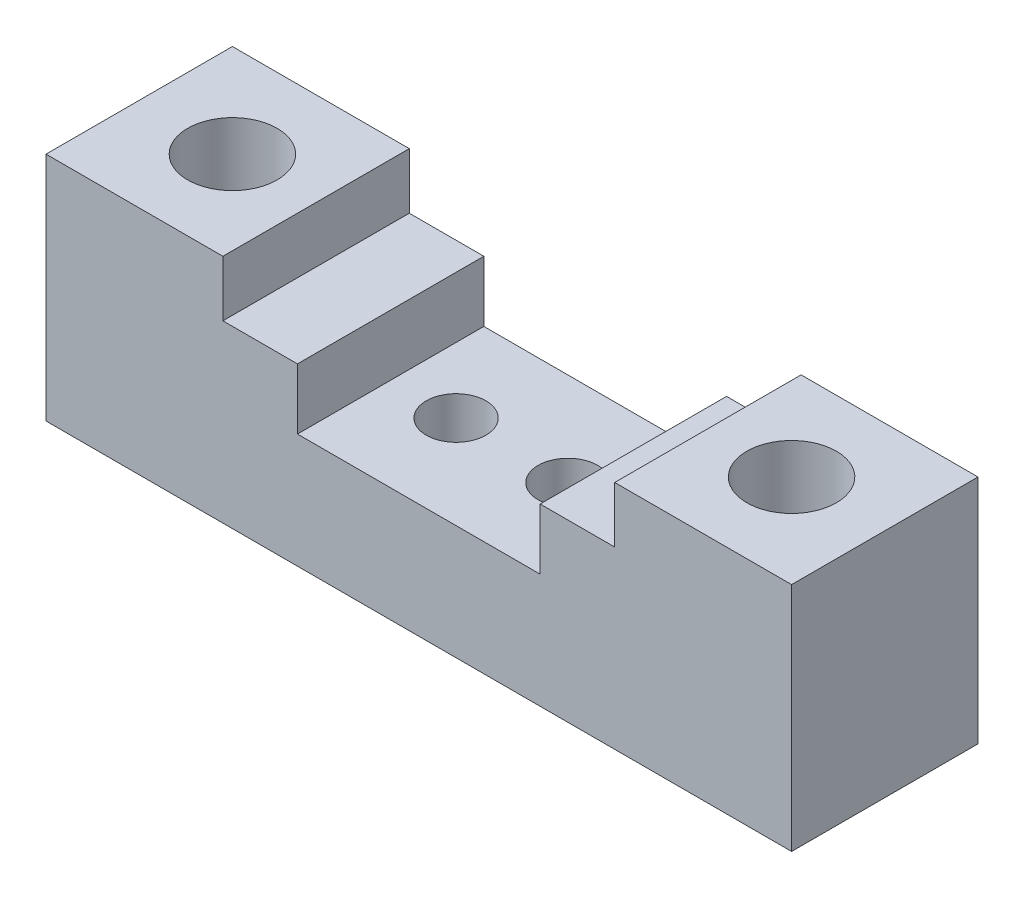
ISO-10303-21;
HEADER;
FILE_DESCRIPTION(('STEP AP214'),'2;1');
FILE_NAME('part.step','',(''),(''),'','','');
FILE_SCHEMA(('AUTOMOTIVE_DESIGN { 1 0 10303 214 1 1 1 1 }'));
ENDSEC;
DATA;
#1=APPLICATION_CONTEXT('core data for automotive mechanical design processes');
#2=APPLICATION_PROTOCOL_DEFINITION('international standard','automotive_design',2000,#1);
#3=PRODUCT_CONTEXT('',#1,'mechanical');
#4=PRODUCT('Part','Part','',(#3));
#5=PRODUCT_RELATED_PRODUCT_CATEGORY('part','',(#4));
#6=PRODUCT_DEFINITION_FORMATION('','',#4);
#7=PRODUCT_DEFINITION_CONTEXT('part definition',#1,'design');
#8=PRODUCT_DEFINITION('design','',#6,#7);
#9=PRODUCT_DEFINITION_SHAPE('','',#8);
#10=(LENGTH_UNIT() NAMED_UNIT(*) SI_UNIT(.MILLI.,.METRE.));
#11=(NAMED_UNIT(*) PLANE_ANGLE_UNIT() SI_UNIT($,.RADIAN.));
#12=(NAMED_UNIT(*) SI_UNIT($,.STERADIAN.) SOLID_ANGLE_UNIT());
#13=UNCERTAINTY_MEASURE_WITH_UNIT(LENGTH_MEASURE(1.E-05),#10,'distance_accuracy_value','');
#14=(GEOMETRIC_REPRESENTATION_CONTEXT(3) GLOBAL_UNCERTAINTY_ASSIGNED_CONTEXT((#13)) GLOBAL_UNIT_ASSIGNED_CONTEXT((#10,
#11,#12)) REPRESENTATION_CONTEXT('',''));
#15=CARTESIAN_POINT('',(0.,0.,0.));
#16=DIRECTION('',(0.,0.,1.));
#17=DIRECTION('',(1.,0.,0.));
#18=AXIS2_PLACEMENT_3D('',#15,#16,#17);
#19=CARTESIAN_POINT('',(5.255,4.7,-2.5));
#20=DIRECTION('',(0.,-1.,0.));
#21=DIRECTION('',(0.,0.,-1.));
#22=AXIS2_PLACEMENT_3D('',#19,#20,#21);
#23=PLANE('',#22);
#24=DIRECTION('',(-1.,0.,0.));
#25=VECTOR('',#24,1.);
#26=CARTESIAN_POINT('',(-5.255,4.7,-2.5));
#27=LINE('',#26,#25);
#28=CARTESIAN_POINT('',(5.255,4.7,-2.5));
#29=VERTEX_POINT('',#28);
#30=CARTESIAN_POINT('',(3.255,4.7,-2.5));
#31=VERTEX_POINT('',#30);
#32=EDGE_CURVE('E166',#29,#31,#27,.T.);
#33=ORIENTED_EDGE('',*,*,#32,.T.);
#34=DIRECTION('',(0.,0.,-1.));
#35=VECTOR('',#34,1.);
#36=CARTESIAN_POINT('',(3.255,4.7,2.5));
#37=LINE('',#36,#35);
#38=CARTESIAN_POINT('',(3.255,4.7,2.5));
#39=VERTEX_POINT('',#38);
#40=EDGE_CURVE('E127',#39,#31,#37,.T.);
#41=ORIENTED_EDGE('',*,*,#40,.F.);
#42=DIRECTION('',(1.,0.,0.));
#43=VECTOR('',#42,1.);
#44=CARTESIAN_POINT('',(-5.255,4.7,2.5));
#45=LINE('',#44,#43);
#46=CARTESIAN_POINT('',(5.255,4.7,2.5));
#47=VERTEX_POINT('',#46);
#48=EDGE_CURVE('E171',#39,#47,#45,.T.);
#49=ORIENTED_EDGE('',*,*,#48,.T.);
#50=DIRECTION('',(0.,0.,-1.));
#51=VECTOR('',#50,1.);
#52=CARTESIAN_POINT('',(5.255,4.7,2.5));
#53=LINE('',#52,#51);
#54=EDGE_CURVE('E161',#47,#29,#53,.T.);
#55=ORIENTED_EDGE('',*,*,#54,.T.);
#56=EDGE_LOOP('',(#33,#41,#49,#55));
#57=FACE_BOUND('',#56,.T.);
#58=ADVANCED_FACE('F30',(#57),#23,.F.);
#59=CARTESIAN_POINT('',(10.,6.2,-2.5));
#60=DIRECTION('',(0.,-1.,0.));
#61=DIRECTION('',(0.,0.,-1.));
#62=AXIS2_PLACEMENT_3D('',#59,#60,#61);
#63=PLANE('',#62);
#64=CARTESIAN_POINT('',(7.5,6.2,0.));
#65=DIRECTION('',(0.,-1.,0.));
#66=DIRECTION('',(0.,0.,-1.));
#67=AXIS2_PLACEMENT_3D('',#64,#65,#66);
#68=CIRCLE('',#67,1.2);
#69=CARTESIAN_POINT('',(7.5,6.2,-1.2));
#70=VERTEX_POINT('',#69);
#71=EDGE_CURVE('E237',#70,#70,#68,.T.);
#72=ORIENTED_EDGE('',*,*,#71,.T.);
#73=EDGE_LOOP('',(#72));
#74=FACE_BOUND('',#73,.T.);
#75=DIRECTION('',(-1.,0.,0.));
#76=VECTOR('',#75,1.);
#77=CARTESIAN_POINT('',(-10.,6.2,-2.5));
#78=LINE('',#77,#76);
#79=CARTESIAN_POINT('',(10.,6.2,-2.5));
#80=VERTEX_POINT('',#79);
#81=CARTESIAN_POINT('',(5.255,6.2,-2.5));
#82=VERTEX_POINT('',#81);
#83=EDGE_CURVE('E192',#80,#82,#78,.T.);
#84=ORIENTED_EDGE('',*,*,#83,.T.);
#85=DIRECTION('',(0.,0.,-1.));
#86=VECTOR('',#85,1.);
#87=CARTESIAN_POINT('',(5.255,6.2,2.5));
#88=LINE('',#87,#86);
#89=CARTESIAN_POINT('',(5.255,6.2,2.5));
#90=VERTEX_POINT('',#89);
#91=EDGE_CURVE('E156',#90,#82,#88,.T.);
#92=ORIENTED_EDGE('',*,*,#91,.F.);
#93=DIRECTION('',(1.,0.,0.));
#94=VECTOR('',#93,1.);
#95=CARTESIAN_POINT('',(-10.,6.2,2.5));
#96=LINE('',#95,#94);
#97=CARTESIAN_POINT('',(10.,6.2,2.5));
#98=VERTEX_POINT('',#97);
#99=EDGE_CURVE('E197',#90,#98,#96,.T.);
#100=ORIENTED_EDGE('',*,*,#99,.T.);
#101=DIRECTION('',(0.,0.,-1.));
#102=VECTOR('',#101,1.);
#103=CARTESIAN_POINT('',(10.,6.2,2.5));
#104=LINE('',#103,#102);
#105=EDGE_CURVE('E187',#98,#80,#104,.T.);
#106=ORIENTED_EDGE('',*,*,#105,.T.);
#107=EDGE_LOOP('',(#84,#92,#100,#106));
#108=FACE_BOUND('',#107,.T.);
#109=ADVANCED_FACE('F300',(#74,#108),#63,.F.);
#110=CARTESIAN_POINT('',(10.,6.2,2.5));
#111=DIRECTION('',(-1.,0.,0.));
#112=DIRECTION('',(0.,0.,1.));
#113=AXIS2_PLACEMENT_3D('',#110,#111,#112);
#114=PLANE('',#113);
#115=DIRECTION('',(0.,0.,-1.));
#116=VECTOR('',#115,1.);
#117=CARTESIAN_POINT('',(10.,0.,2.5));
#118=LINE('',#117,#116);
#119=CARTESIAN_POINT('',(10.,0.,2.5));
#120=VERTEX_POINT('',#119);
#121=CARTESIAN_POINT('',(10.,0.,-2.5));
#122=VERTEX_POINT('',#121);
#123=EDGE_CURVE('E180',#120,#122,#118,.T.);
#124=ORIENTED_EDGE('',*,*,#123,.T.);
#125=DIRECTION('',(0.,-1.,0.));
#126=VECTOR('',#125,1.);
#127=CARTESIAN_POINT('',(10.,6.2,-2.5));
#128=LINE('',#127,#126);
#129=EDGE_CURVE('E11',#80,#122,#128,.T.);
#130=ORIENTED_EDGE('',*,*,#129,.F.);
#131=ORIENTED_EDGE('',*,*,#105,.F.);
#132=DIRECTION('',(0.,-1.,0.));
#133=VECTOR('',#132,1.);
#134=CARTESIAN_POINT('',(10.,6.2,2.5));
#135=LINE('',#134,#133);
#136=EDGE_CURVE('E201',#98,#120,#135,.T.);
#137=ORIENTED_EDGE('',*,*,#136,.T.);
#138=EDGE_LOOP('',(#124,#130,#131,#137));
#139=FACE_BOUND('',#138,.T.);
#140=ADVANCED_FACE('F32',(#139),#114,.F.);
#141=CARTESIAN_POINT('',(-10.,6.2,-2.5));
#142=DIRECTION('',(0.,0.,1.));
#143=DIRECTION('',(1.,0.,0.));
#144=AXIS2_PLACEMENT_3D('',#141,#142,#143);
#145=PLANE('',#144);
#146=DIRECTION('',(-1.,0.,0.));
#147=VECTOR('',#146,1.);
#148=CARTESIAN_POINT('',(-3.255,3.07,-2.5));
#149=LINE('',#148,#147);
#150=CARTESIAN_POINT('',(3.255,3.07,-2.5));
#151=VERTEX_POINT('',#150);
#152=CARTESIAN_POINT('',(-3.255,3.07,-2.5));
#153=VERTEX_POINT('',#152);
#154=EDGE_CURVE('E138',#151,#153,#149,.T.);
#155=ORIENTED_EDGE('',*,*,#154,.F.);
#156=DIRECTION('',(0.,1.,0.));
#157=VECTOR('',#156,1.);
#158=CARTESIAN_POINT('',(3.255,3.07,-2.5));
#159=LINE('',#158,#157);
#160=EDGE_CURVE('E121',#151,#31,#159,.T.);
#161=ORIENTED_EDGE('',*,*,#160,.T.);
#162=ORIENTED_EDGE('',*,*,#32,.F.);
#163=DIRECTION('',(0.,1.,0.));
#164=VECTOR('',#163,1.);
#165=CARTESIAN_POINT('',(5.255,4.7,-2.5));
#166=LINE('',#165,#164);
#167=EDGE_CURVE('E175',#29,#82,#166,.T.);
#168=ORIENTED_EDGE('',*,*,#167,.T.);
#169=ORIENTED_EDGE('',*,*,#83,.F.);
#170=ORIENTED_EDGE('',*,*,#129,.T.);
#171=DIRECTION('',(-1.,0.,0.));
#172=VECTOR('',#171,1.);
#173=CARTESIAN_POINT('',(-10.,0.,-2.5));
#174=LINE('',#173,#172);
#175=CARTESIAN_POINT('',(-10.,0.,-2.5));
#176=VERTEX_POINT('',#175);
#177=EDGE_CURVE('E204',#122,#176,#174,.T.);
#178=ORIENTED_EDGE('',*,*,#177,.T.);
#179=DIRECTION('',(0.,-1.,0.));
#180=VECTOR('',#179,1.);
#181=CARTESIAN_POINT('',(-10.,6.2,-2.5));
#182=LINE('',#181,#180);
#183=CARTESIAN_POINT('',(-10.,6.2,-2.5));
#184=VERTEX_POINT('',#183);
#185=EDGE_CURVE('E39',#184,#176,#182,.T.);
#186=ORIENTED_EDGE('',*,*,#185,.F.);
#187=CARTESIAN_POINT('',(-5.255,6.2,-2.5));
#188=VERTEX_POINT('',#187);
#189=EDGE_CURVE('E190',#188,#184,#78,.T.);
#190=ORIENTED_EDGE('',*,*,#189,.F.);
#191=DIRECTION('',(0.,1.,0.));
#192=VECTOR('',#191,1.);
#193=CARTESIAN_POINT('',(-5.255,4.7,-2.5));
#194=LINE('',#193,#192);
#195=CARTESIAN_POINT('',(-5.255,4.7,-2.5));
#196=VERTEX_POINT('',#195);
#197=EDGE_CURVE('E55',#196,#188,#194,.T.);
#198=ORIENTED_EDGE('',*,*,#197,.F.);
#199=CARTESIAN_POINT('',(-3.255,4.7,-2.5));
#200=VERTEX_POINT('',#199);
#201=EDGE_CURVE('E164',#200,#196,#27,.T.);
#202=ORIENTED_EDGE('',*,*,#201,.F.);
#203=DIRECTION('',(0.,1.,0.));
#204=VECTOR('',#203,1.);
#205=CARTESIAN_POINT('',(-3.255,3.07,-2.5));
#206=LINE('',#205,#204);
#207=EDGE_CURVE('E47',#153,#200,#206,.T.);
#208=ORIENTED_EDGE('',*,*,#207,.F.);
#209=EDGE_LOOP('',(#155,#161,#162,#168,#169,#170,#178,#186,#190,#198,#202,#208));
#210=FACE_BOUND('',#209,.T.);
#211=ADVANCED_FACE('F143',(#210),#145,.F.);
#212=CARTESIAN_POINT('',(-10.,6.2,2.5));
#213=DIRECTION('',(1.,0.,0.));
#214=DIRECTION('',(0.,0.,-1.));
#215=AXIS2_PLACEMENT_3D('',#212,#213,#214);
#216=PLANE('',#215);
#217=DIRECTION('',(0.,0.,1.));
#218=VECTOR('',#217,1.);
#219=CARTESIAN_POINT('',(-10.,0.,2.5));
#220=LINE('',#219,#218);
#221=CARTESIAN_POINT('',(-10.,0.,2.5));
#222=VERTEX_POINT('',#221);
#223=EDGE_CURVE('E206',#176,#222,#220,.T.);
#224=ORIENTED_EDGE('',*,*,#223,.T.);
#225=DIRECTION('',(0.,-1.,0.));
#226=VECTOR('',#225,1.);
#227=CARTESIAN_POINT('',(-10.,6.2,2.5));
#228=LINE('',#227,#226);
#229=CARTESIAN_POINT('',(-10.,6.2,2.5));
#230=VERTEX_POINT('',#229);
#231=EDGE_CURVE('E211',#230,#222,#228,.T.);
#232=ORIENTED_EDGE('',*,*,#231,.F.);
#233=DIRECTION('',(0.,0.,1.));
#234=VECTOR('',#233,1.);
#235=CARTESIAN_POINT('',(-10.,6.2,2.5));
#236=LINE('',#235,#234);
#237=EDGE_CURVE('E195',#184,#230,#236,.T.);
#238=ORIENTED_EDGE('',*,*,#237,.F.);
#239=ORIENTED_EDGE('',*,*,#185,.T.);
#240=EDGE_LOOP('',(#224,#232,#238,#239));
#241=FACE_BOUND('',#240,.T.);
#242=ADVANCED_FACE('F295',(#241),#216,.F.);
#243=CARTESIAN_POINT('',(-10.,6.2,2.5));
#244=DIRECTION('',(0.,0.,-1.));
#245=DIRECTION('',(-1.,0.,0.));
#246=AXIS2_PLACEMENT_3D('',#243,#244,#245);
#247=PLANE('',#246);
#248=ORIENTED_EDGE('',*,*,#48,.F.);
#249=DIRECTION('',(0.,1.,0.));
#250=VECTOR('',#249,1.);
#251=CARTESIAN_POINT('',(3.255,3.07,2.5));
#252=LINE('',#251,#250);
#253=CARTESIAN_POINT('',(3.255,3.07,2.5));
#254=VERTEX_POINT('',#253);
#255=EDGE_CURVE('E154',#254,#39,#252,.T.);
#256=ORIENTED_EDGE('',*,*,#255,.F.);
#257=DIRECTION('',(1.,0.,0.));
#258=VECTOR('',#257,1.);
#259=CARTESIAN_POINT('',(-3.255,3.07,2.5));
#260=LINE('',#259,#258);
#261=CARTESIAN_POINT('',(-3.255,3.07,2.5));
#262=VERTEX_POINT('',#261);
#263=EDGE_CURVE('E132',#262,#254,#260,.T.);
#264=ORIENTED_EDGE('',*,*,#263,.F.);
#265=DIRECTION('',(0.,1.,0.));
#266=VECTOR('',#265,1.);
#267=CARTESIAN_POINT('',(-3.255,3.07,2.5));
#268=LINE('',#267,#266);
#269=CARTESIAN_POINT('',(-3.255,4.7,2.5));
#270=VERTEX_POINT('',#269);
#271=EDGE_CURVE('E157',#262,#270,#268,.T.);
#272=ORIENTED_EDGE('',*,*,#271,.T.);
#273=CARTESIAN_POINT('',(-5.255,4.7,2.5));
#274=VERTEX_POINT('',#273);
#275=EDGE_CURVE('E172',#274,#270,#45,.T.);
#276=ORIENTED_EDGE('',*,*,#275,.F.);
#277=DIRECTION('',(0.,1.,0.));
#278=VECTOR('',#277,1.);
#279=CARTESIAN_POINT('',(-5.255,4.7,2.5));
#280=LINE('',#279,#278);
#281=CARTESIAN_POINT('',(-5.255,6.2,2.5));
#282=VERTEX_POINT('',#281);
#283=EDGE_CURVE('E181',#274,#282,#280,.T.);
#284=ORIENTED_EDGE('',*,*,#283,.T.);
#285=EDGE_CURVE('E198',#230,#282,#96,.T.);
#286=ORIENTED_EDGE('',*,*,#285,.F.);
#287=ORIENTED_EDGE('',*,*,#231,.T.);
#288=DIRECTION('',(1.,0.,0.));
#289=VECTOR('',#288,1.);
#290=CARTESIAN_POINT('',(-10.,0.,2.5));
#291=LINE('',#290,#289);
#292=EDGE_CURVE('E191',#222,#120,#291,.T.);
#293=ORIENTED_EDGE('',*,*,#292,.T.);
#294=ORIENTED_EDGE('',*,*,#136,.F.);
#295=ORIENTED_EDGE('',*,*,#99,.F.);
#296=DIRECTION('',(0.,1.,0.));
#297=VECTOR('',#296,1.);
#298=CARTESIAN_POINT('',(5.255,4.7,2.5));
#299=LINE('',#298,#297);
#300=EDGE_CURVE('E178',#47,#90,#299,.T.);
#301=ORIENTED_EDGE('',*,*,#300,.F.);
#302=EDGE_LOOP('',(#248,#256,#264,#272,#276,#284,#286,#287,#293,#294,#295,#301));
#303=FACE_BOUND('',#302,.T.);
#304=ADVANCED_FACE('F289',(#303),#247,.F.);
#305=CARTESIAN_POINT('',(-7.5,6.2,0.));
#306=DIRECTION('',(0.,-1.,0.));
#307=DIRECTION('',(0.,0.,-1.));
#308=AXIS2_PLACEMENT_3D('',#305,#306,#307);
#309=CIRCLE('',#308,1.2);
#310=CARTESIAN_POINT('',(-7.5,6.2,-1.2));
#311=VERTEX_POINT('',#310);
#312=EDGE_CURVE('E152',#311,#311,#309,.T.);
#313=ORIENTED_EDGE('',*,*,#312,.T.);
#314=EDGE_LOOP('',(#313));
#315=FACE_BOUND('',#314,.T.);
#316=ORIENTED_EDGE('',*,*,#285,.T.);
#317=DIRECTION('',(0.,0.,1.));
#318=VECTOR('',#317,1.);
#319=CARTESIAN_POINT('',(-5.255,6.2,2.5));
#320=LINE('',#319,#318);
#321=EDGE_CURVE('E165',#188,#282,#320,.T.);
#322=ORIENTED_EDGE('',*,*,#321,.F.);
#323=ORIENTED_EDGE('',*,*,#189,.T.);
#324=ORIENTED_EDGE('',*,*,#237,.T.);
#325=EDGE_LOOP('',(#316,#322,#323,#324));
#326=FACE_BOUND('',#325,.T.);
#327=ADVANCED_FACE('F251',(#315,#326),#63,.F.);
#328=CARTESIAN_POINT('',(10.,0.,-2.5));
#329=DIRECTION('',(0.,-1.,0.));
#330=DIRECTION('',(0.,0.,-1.));
#331=AXIS2_PLACEMENT_3D('',#328,#329,#330);
#332=PLANE('',#331);
#333=CARTESIAN_POINT('',(1.5,0.,0.));
#334=DIRECTION('',(0.,-1.,0.));
#335=DIRECTION('',(0.,0.,-1.));
#336=AXIS2_PLACEMENT_3D('',#333,#334,#335);
#337=CIRCLE('',#336,0.799999999999988);
#338=CARTESIAN_POINT('',(1.5,0.,-0.799999999999988));
#339=VERTEX_POINT('',#338);
#340=EDGE_CURVE('E229',#339,#339,#337,.T.);
#341=ORIENTED_EDGE('',*,*,#340,.F.);
#342=EDGE_LOOP('',(#341));
#343=FACE_BOUND('',#342,.T.);
#344=CARTESIAN_POINT('',(-1.5,0.,0.));
#345=DIRECTION('',(0.,-1.,0.));
#346=DIRECTION('',(0.,0.,-1.));
#347=AXIS2_PLACEMENT_3D('',#344,#345,#346);
#348=CIRCLE('',#347,0.799999999999988);
#349=CARTESIAN_POINT('',(-1.5,0.,-0.799999999999988));
#350=VERTEX_POINT('',#349);
#351=EDGE_CURVE('E218',#350,#350,#348,.T.);
#352=ORIENTED_EDGE('',*,*,#351,.F.);
#353=EDGE_LOOP('',(#352));
#354=FACE_BOUND('',#353,.T.);
#355=CARTESIAN_POINT('',(7.5,0.,0.));
#356=DIRECTION('',(0.,-1.,0.));
#357=DIRECTION('',(0.,0.,-1.));
#358=AXIS2_PLACEMENT_3D('',#355,#356,#357);
#359=CIRCLE('',#358,2.2);
#360=CARTESIAN_POINT('',(7.5,0.,-2.2));
#361=VERTEX_POINT('',#360);
#362=EDGE_CURVE('E217',#361,#361,#359,.T.);
#363=ORIENTED_EDGE('',*,*,#362,.F.);
#364=EDGE_LOOP('',(#363));
#365=FACE_BOUND('',#364,.T.);
#366=CARTESIAN_POINT('',(-7.5,0.,0.));
#367=DIRECTION('',(0.,-1.,0.));
#368=DIRECTION('',(0.,0.,-1.));
#369=AXIS2_PLACEMENT_3D('',#366,#367,#368);
#370=CIRCLE('',#369,2.2);
#371=CARTESIAN_POINT('',(-7.5,0.,-2.2));
#372=VERTEX_POINT('',#371);
#373=EDGE_CURVE('E240',#372,#372,#370,.T.);
#374=ORIENTED_EDGE('',*,*,#373,.F.);
#375=EDGE_LOOP('',(#374));
#376=FACE_BOUND('',#375,.T.);
#377=ORIENTED_EDGE('',*,*,#123,.F.);
#378=ORIENTED_EDGE('',*,*,#292,.F.);
#379=ORIENTED_EDGE('',*,*,#223,.F.);
#380=ORIENTED_EDGE('',*,*,#177,.F.);
#381=EDGE_LOOP('',(#377,#378,#379,#380));
#382=FACE_BOUND('',#381,.T.);
#383=ADVANCED_FACE('F273',(#343,#354,#365,#376,#382),#332,.T.);
#384=CARTESIAN_POINT('',(5.255,4.7,2.5));
#385=DIRECTION('',(1.,0.,0.));
#386=DIRECTION('',(0.,0.,-1.));
#387=AXIS2_PLACEMENT_3D('',#384,#385,#386);
#388=PLANE('',#387);
#389=ORIENTED_EDGE('',*,*,#91,.T.);
#390=ORIENTED_EDGE('',*,*,#167,.F.);
#391=ORIENTED_EDGE('',*,*,#54,.F.);
#392=ORIENTED_EDGE('',*,*,#300,.T.);
#393=EDGE_LOOP('',(#389,#390,#391,#392));
#394=FACE_BOUND('',#393,.T.);
#395=ADVANCED_FACE('F276',(#394),#388,.F.);
#396=CARTESIAN_POINT('',(-5.255,4.7,2.5));
#397=DIRECTION('',(-1.,0.,0.));
#398=DIRECTION('',(0.,0.,1.));
#399=AXIS2_PLACEMENT_3D('',#396,#397,#398);
#400=PLANE('',#399);
#401=ORIENTED_EDGE('',*,*,#321,.T.);
#402=ORIENTED_EDGE('',*,*,#283,.F.);
#403=DIRECTION('',(0.,0.,1.));
#404=VECTOR('',#403,1.);
#405=CARTESIAN_POINT('',(-5.255,4.7,2.5));
#406=LINE('',#405,#404);
#407=EDGE_CURVE('E168',#196,#274,#406,.T.);
#408=ORIENTED_EDGE('',*,*,#407,.F.);
#409=ORIENTED_EDGE('',*,*,#197,.T.);
#410=EDGE_LOOP('',(#401,#402,#408,#409));
#411=FACE_BOUND('',#410,.T.);
#412=ADVANCED_FACE('F315',(#411),#400,.F.);
#413=ORIENTED_EDGE('',*,*,#275,.T.);
#414=DIRECTION('',(0.,0.,1.));
#415=VECTOR('',#414,1.);
#416=CARTESIAN_POINT('',(-3.255,4.7,2.5));
#417=LINE('',#416,#415);
#418=EDGE_CURVE('E141',#200,#270,#417,.T.);
#419=ORIENTED_EDGE('',*,*,#418,.F.);
#420=ORIENTED_EDGE('',*,*,#201,.T.);
#421=ORIENTED_EDGE('',*,*,#407,.T.);
#422=EDGE_LOOP('',(#413,#419,#420,#421));
#423=FACE_BOUND('',#422,.T.);
#424=ADVANCED_FACE('F306',(#423),#23,.F.);
#425=CARTESIAN_POINT('',(3.255,3.07,2.5));
#426=DIRECTION('',(1.,0.,0.));
#427=DIRECTION('',(0.,0.,-1.));
#428=AXIS2_PLACEMENT_3D('',#425,#426,#427);
#429=PLANE('',#428);
#430=ORIENTED_EDGE('',*,*,#40,.T.);
#431=ORIENTED_EDGE('',*,*,#160,.F.);
#432=DIRECTION('',(0.,0.,-1.));
#433=VECTOR('',#432,1.);
#434=CARTESIAN_POINT('',(3.255,3.07,2.5));
#435=LINE('',#434,#433);
#436=EDGE_CURVE('E124',#254,#151,#435,.T.);
#437=ORIENTED_EDGE('',*,*,#436,.F.);
#438=ORIENTED_EDGE('',*,*,#255,.T.);
#439=EDGE_LOOP('',(#430,#431,#437,#438));
#440=FACE_BOUND('',#439,.T.);
#441=ADVANCED_FACE('F123',(#440),#429,.F.);
#442=CARTESIAN_POINT('',(-3.255,3.07,2.5));
#443=DIRECTION('',(-1.,0.,0.));
#444=DIRECTION('',(0.,0.,1.));
#445=AXIS2_PLACEMENT_3D('',#442,#443,#444);
#446=PLANE('',#445);
#447=ORIENTED_EDGE('',*,*,#418,.T.);
#448=ORIENTED_EDGE('',*,*,#271,.F.);
#449=DIRECTION('',(0.,0.,1.));
#450=VECTOR('',#449,1.);
#451=CARTESIAN_POINT('',(-3.255,3.07,2.5));
#452=LINE('',#451,#450);
#453=EDGE_CURVE('E145',#153,#262,#452,.T.);
#454=ORIENTED_EDGE('',*,*,#453,.F.);
#455=ORIENTED_EDGE('',*,*,#207,.T.);
#456=EDGE_LOOP('',(#447,#448,#454,#455));
#457=FACE_BOUND('',#456,.T.);
#458=ADVANCED_FACE('F321',(#457),#446,.F.);
#459=CARTESIAN_POINT('',(3.255,3.07,-2.5));
#460=DIRECTION('',(0.,-1.,0.));
#461=DIRECTION('',(0.,0.,-1.));
#462=AXIS2_PLACEMENT_3D('',#459,#460,#461);
#463=PLANE('',#462);
#464=CARTESIAN_POINT('',(1.5,3.07,0.));
#465=DIRECTION('',(0.,-1.,0.));
#466=DIRECTION('',(0.,0.,-1.));
#467=AXIS2_PLACEMENT_3D('',#464,#465,#466);
#468=CIRCLE('',#467,0.799999999999993);
#469=CARTESIAN_POINT('',(1.5,3.07,-0.799999999999993));
#470=VERTEX_POINT('',#469);
#471=EDGE_CURVE('E34',#470,#470,#468,.T.);
#472=ORIENTED_EDGE('',*,*,#471,.T.);
#473=EDGE_LOOP('',(#472));
#474=FACE_BOUND('',#473,.T.);
#475=CARTESIAN_POINT('',(-1.5,3.07,0.));
#476=DIRECTION('',(0.,-1.,0.));
#477=DIRECTION('',(0.,0.,-1.));
#478=AXIS2_PLACEMENT_3D('',#475,#476,#477);
#479=CIRCLE('',#478,0.799999999999993);
#480=CARTESIAN_POINT('',(-1.5,3.07,-0.799999999999993));
#481=VERTEX_POINT('',#480);
#482=EDGE_CURVE('E215',#481,#481,#479,.T.);
#483=ORIENTED_EDGE('',*,*,#482,.T.);
#484=EDGE_LOOP('',(#483));
#485=FACE_BOUND('',#484,.T.);
#486=ORIENTED_EDGE('',*,*,#436,.T.);
#487=ORIENTED_EDGE('',*,*,#154,.T.);
#488=ORIENTED_EDGE('',*,*,#453,.T.);
#489=ORIENTED_EDGE('',*,*,#263,.T.);
#490=EDGE_LOOP('',(#486,#487,#488,#489));
#491=FACE_BOUND('',#490,.T.);
#492=ADVANCED_FACE('F136',(#474,#485,#491),#463,.F.);
#493=CARTESIAN_POINT('',(-7.5,0.,0.));
#494=DIRECTION('',(0.,-1.,0.));
#495=DIRECTION('',(0.,0.,-1.));
#496=AXIS2_PLACEMENT_3D('',#493,#494,#495);
#497=CYLINDRICAL_SURFACE('',#496,1.2);
#498=ORIENTED_EDGE('',*,*,#312,.F.);
#499=EDGE_LOOP('',(#498));
#500=FACE_BOUND('',#499,.T.);
#501=CARTESIAN_POINT('',(-7.5,2.,0.));
#502=DIRECTION('',(0.,-1.,0.));
#503=DIRECTION('',(0.,0.,-1.));
#504=AXIS2_PLACEMENT_3D('',#501,#502,#503);
#505=CIRCLE('',#504,1.2);
#506=CARTESIAN_POINT('',(-7.5,2.,-1.2));
#507=VERTEX_POINT('',#506);
#508=EDGE_CURVE('E246',#507,#507,#505,.T.);
#509=ORIENTED_EDGE('',*,*,#508,.T.);
#510=EDGE_LOOP('',(#509));
#511=FACE_BOUND('',#510,.T.);
#512=ADVANCED_FACE('F254',(#500,#511),#497,.F.);
#513=CARTESIAN_POINT('',(-6.3,2.,0.));
#514=DIRECTION('',(0.,1.,0.));
#515=DIRECTION('',(0.,0.,1.));
#516=AXIS2_PLACEMENT_3D('',#513,#514,#515);
#517=PLANE('',#516);
#518=ORIENTED_EDGE('',*,*,#508,.F.);
#519=EDGE_LOOP('',(#518));
#520=FACE_BOUND('',#519,.T.);
#521=CARTESIAN_POINT('',(-7.5,2.,0.));
#522=DIRECTION('',(0.,-1.,0.));
#523=DIRECTION('',(0.,0.,-1.));
#524=AXIS2_PLACEMENT_3D('',#521,#522,#523);
#525=CIRCLE('',#524,2.2);
#526=CARTESIAN_POINT('',(-7.5,2.,-2.2));
#527=VERTEX_POINT('',#526);
#528=EDGE_CURVE('E243',#527,#527,#525,.T.);
#529=ORIENTED_EDGE('',*,*,#528,.T.);
#530=EDGE_LOOP('',(#529));
#531=FACE_BOUND('',#530,.T.);
#532=ADVANCED_FACE('F257',(#520,#531),#517,.F.);
#533=CARTESIAN_POINT('',(-7.5,0.,0.));
#534=DIRECTION('',(0.,-1.,0.));
#535=DIRECTION('',(0.,0.,-1.));
#536=AXIS2_PLACEMENT_3D('',#533,#534,#535);
#537=CYLINDRICAL_SURFACE('',#536,2.2);
#538=ORIENTED_EDGE('',*,*,#528,.F.);
#539=EDGE_LOOP('',(#538));
#540=FACE_BOUND('',#539,.T.);
#541=ORIENTED_EDGE('',*,*,#373,.T.);
#542=EDGE_LOOP('',(#541));
#543=FACE_BOUND('',#542,.T.);
#544=ADVANCED_FACE('F263',(#540,#543),#537,.F.);
#545=CARTESIAN_POINT('',(7.5,0.,0.));
#546=DIRECTION('',(0.,-1.,0.));
#547=DIRECTION('',(0.,0.,-1.));
#548=AXIS2_PLACEMENT_3D('',#545,#546,#547);
#549=CYLINDRICAL_SURFACE('',#548,1.2);
#550=ORIENTED_EDGE('',*,*,#71,.F.);
#551=EDGE_LOOP('',(#550));
#552=FACE_BOUND('',#551,.T.);
#553=CARTESIAN_POINT('',(7.5,2.,0.));
#554=DIRECTION('',(0.,-1.,0.));
#555=DIRECTION('',(0.,0.,-1.));
#556=AXIS2_PLACEMENT_3D('',#553,#554,#555);
#557=CIRCLE('',#556,1.2);
#558=CARTESIAN_POINT('',(7.5,2.,-1.2));
#559=VERTEX_POINT('',#558);
#560=EDGE_CURVE('E234',#559,#559,#557,.T.);
#561=ORIENTED_EDGE('',*,*,#560,.T.);
#562=EDGE_LOOP('',(#561));
#563=FACE_BOUND('',#562,.T.);
#564=ADVANCED_FACE('F269',(#552,#563),#549,.F.);
#565=CARTESIAN_POINT('',(8.7,2.,0.));
#566=DIRECTION('',(0.,1.,0.));
#567=DIRECTION('',(0.,0.,1.));
#568=AXIS2_PLACEMENT_3D('',#565,#566,#567);
#569=PLANE('',#568);
#570=ORIENTED_EDGE('',*,*,#560,.F.);
#571=EDGE_LOOP('',(#570));
#572=FACE_BOUND('',#571,.T.);
#573=CARTESIAN_POINT('',(7.5,2.,0.));
#574=DIRECTION('',(0.,-1.,0.));
#575=DIRECTION('',(0.,0.,-1.));
#576=AXIS2_PLACEMENT_3D('',#573,#574,#575);
#577=CIRCLE('',#576,2.2);
#578=CARTESIAN_POINT('',(7.5,2.,-2.2));
#579=VERTEX_POINT('',#578);
#580=EDGE_CURVE('E222',#579,#579,#577,.T.);
#581=ORIENTED_EDGE('',*,*,#580,.T.);
#582=EDGE_LOOP('',(#581));
#583=FACE_BOUND('',#582,.T.);
#584=ADVANCED_FACE('F333',(#572,#583),#569,.F.);
#585=CARTESIAN_POINT('',(7.5,0.,0.));
#586=DIRECTION('',(0.,-1.,0.));
#587=DIRECTION('',(0.,0.,-1.));
#588=AXIS2_PLACEMENT_3D('',#585,#586,#587);
#589=CYLINDRICAL_SURFACE('',#588,2.2);
#590=ORIENTED_EDGE('',*,*,#580,.F.);
#591=EDGE_LOOP('',(#590));
#592=FACE_BOUND('',#591,.T.);
#593=ORIENTED_EDGE('',*,*,#362,.T.);
#594=EDGE_LOOP('',(#593));
#595=FACE_BOUND('',#594,.T.);
#596=ADVANCED_FACE('F337',(#592,#595),#589,.F.);
#597=CARTESIAN_POINT('',(-1.5,0.,0.));
#598=DIRECTION('',(0.,-1.,0.));
#599=DIRECTION('',(0.,0.,-1.));
#600=AXIS2_PLACEMENT_3D('',#597,#598,#599);
#601=CYLINDRICAL_SURFACE('',#600,0.799999999999993);
#602=ORIENTED_EDGE('',*,*,#351,.T.);
#603=EDGE_LOOP('',(#602));
#604=FACE_BOUND('',#603,.T.);
#605=ORIENTED_EDGE('',*,*,#482,.F.);
#606=EDGE_LOOP('',(#605));
#607=FACE_BOUND('',#606,.T.);
#608=ADVANCED_FACE('F341',(#604,#607),#601,.F.);
#609=CARTESIAN_POINT('',(1.5,0.,0.));
#610=DIRECTION('',(0.,-1.,0.));
#611=DIRECTION('',(0.,0.,-1.));
#612=AXIS2_PLACEMENT_3D('',#609,#610,#611);
#613=CYLINDRICAL_SURFACE('',#612,0.799999999999993);
#614=ORIENTED_EDGE('',*,*,#340,.T.);
#615=EDGE_LOOP('',(#614));
#616=FACE_BOUND('',#615,.T.);
#617=ORIENTED_EDGE('',*,*,#471,.F.);
#618=EDGE_LOOP('',(#617));
#619=FACE_BOUND('',#618,.T.);
#620=ADVANCED_FACE('F345',(#616,#619),#613,.F.);
#621=CLOSED_SHELL('',(#58,#109,#140,#211,#242,#304,#327,#383,#395,#412,#424,#441,#458,#492,#512,
#532,#544,#564,#584,#596,#608,#620));
#622=MANIFOLD_SOLID_BREP('B2',#621);
#623=ADVANCED_BREP_SHAPE_REPRESENTATION('',(#18,#622),#14);
#624=SHAPE_DEFINITION_REPRESENTATION(#9,#623);
ENDSEC;
END-ISO-10303-21;
